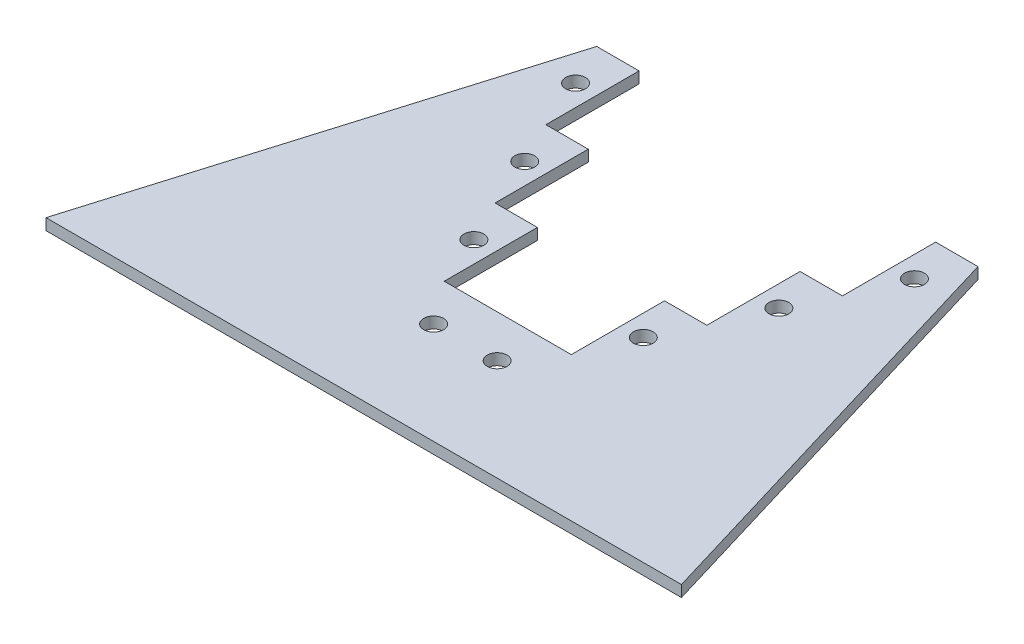
ISO-10303-21;
HEADER;
FILE_DESCRIPTION(('STEP AP214'),'2;1');
FILE_NAME('part.step','',(''),(''),'','','');
FILE_SCHEMA(('AUTOMOTIVE_DESIGN { 1 0 10303 214 1 1 1 1 }'));
ENDSEC;
DATA;
#1=APPLICATION_CONTEXT('core data for automotive mechanical design processes');
#2=APPLICATION_PROTOCOL_DEFINITION('international standard','automotive_design',2000,#1);
#3=PRODUCT_CONTEXT('',#1,'mechanical');
#4=PRODUCT('Part','Part','',(#3));
#5=PRODUCT_RELATED_PRODUCT_CATEGORY('part','',(#4));
#6=PRODUCT_DEFINITION_FORMATION('','',#4);
#7=PRODUCT_DEFINITION_CONTEXT('part definition',#1,'design');
#8=PRODUCT_DEFINITION('design','',#6,#7);
#9=PRODUCT_DEFINITION_SHAPE('','',#8);
#10=(LENGTH_UNIT() NAMED_UNIT(*) SI_UNIT(.MILLI.,.METRE.));
#11=(NAMED_UNIT(*) PLANE_ANGLE_UNIT() SI_UNIT($,.RADIAN.));
#12=(NAMED_UNIT(*) SI_UNIT($,.STERADIAN.) SOLID_ANGLE_UNIT());
#13=UNCERTAINTY_MEASURE_WITH_UNIT(LENGTH_MEASURE(1.E-05),#10,'distance_accuracy_value','');
#14=(GEOMETRIC_REPRESENTATION_CONTEXT(3) GLOBAL_UNCERTAINTY_ASSIGNED_CONTEXT((#13)) GLOBAL_UNIT_ASSIGNED_CONTEXT((#10,
#11,#12)) REPRESENTATION_CONTEXT('',''));
#15=CARTESIAN_POINT('',(0.,0.,0.));
#16=DIRECTION('',(0.,0.,1.));
#17=DIRECTION('',(1.,0.,0.));
#18=AXIS2_PLACEMENT_3D('',#15,#16,#17);
#19=CARTESIAN_POINT('',(0.,4.,0.));
#20=DIRECTION('',(0.,0.,-1.));
#21=DIRECTION('',(-1.,0.,0.));
#22=AXIS2_PLACEMENT_3D('',#19,#20,#21);
#23=PLANE('',#22);
#24=DIRECTION('',(1.,0.,0.));
#25=VECTOR('',#24,1.);
#26=CARTESIAN_POINT('',(0.,0.,0.));
#27=LINE('',#26,#25);
#28=CARTESIAN_POINT('',(-180.,0.,0.));
#29=VERTEX_POINT('',#28);
#30=CARTESIAN_POINT('',(45.0000000000001,0.,0.));
#31=VERTEX_POINT('',#30);
#32=EDGE_CURVE('E195',#29,#31,#27,.T.);
#33=ORIENTED_EDGE('',*,*,#32,.T.);
#34=DIRECTION('',(0.,-1.,0.));
#35=VECTOR('',#34,1.);
#36=CARTESIAN_POINT('',(45.0000000000001,4.,0.));
#37=LINE('',#36,#35);
#38=CARTESIAN_POINT('',(45.0000000000001,4.,0.));
#39=VERTEX_POINT('',#38);
#40=EDGE_CURVE('E11',#39,#31,#37,.T.);
#41=ORIENTED_EDGE('',*,*,#40,.F.);
#42=DIRECTION('',(1.,0.,0.));
#43=VECTOR('',#42,1.);
#44=CARTESIAN_POINT('',(0.,4.,0.));
#45=LINE('',#44,#43);
#46=CARTESIAN_POINT('',(-180.,4.,0.));
#47=VERTEX_POINT('',#46);
#48=EDGE_CURVE('E238',#47,#39,#45,.T.);
#49=ORIENTED_EDGE('',*,*,#48,.F.);
#50=DIRECTION('',(0.,-1.,0.));
#51=VECTOR('',#50,1.);
#52=CARTESIAN_POINT('',(-180.,4.,0.));
#53=LINE('',#52,#51);
#54=EDGE_CURVE('E63',#47,#29,#53,.T.);
#55=ORIENTED_EDGE('',*,*,#54,.T.);
#56=EDGE_LOOP('',(#33,#41,#49,#55));
#57=FACE_BOUND('',#56,.T.);
#58=ADVANCED_FACE('F47',(#57),#23,.F.);
#59=CARTESIAN_POINT('',(41.2844036697248,4.,-12.3853211009175));
#60=DIRECTION('',(-0.957826285221151,0.,0.287347885566346));
#61=DIRECTION('',(0.287347885566346,0.,0.957826285221151));
#62=AXIS2_PLACEMENT_3D('',#59,#60,#61);
#63=PLANE('',#62);
#64=DIRECTION('',(-0.287347885566346,0.,-0.957826285221151));
#65=VECTOR('',#64,1.);
#66=CARTESIAN_POINT('',(41.2844036697248,0.,-12.3853211009175));
#67=LINE('',#66,#65);
#68=CARTESIAN_POINT('',(0.,0.,-150.));
#69=VERTEX_POINT('',#68);
#70=EDGE_CURVE('E197',#31,#69,#67,.T.);
#71=ORIENTED_EDGE('',*,*,#70,.T.);
#72=DIRECTION('',(0.,-1.,0.));
#73=VECTOR('',#72,1.);
#74=CARTESIAN_POINT('',(0.,4.,-150.));
#75=LINE('',#74,#73);
#76=CARTESIAN_POINT('',(0.,4.,-150.));
#77=VERTEX_POINT('',#76);
#78=EDGE_CURVE('E55',#77,#69,#75,.T.);
#79=ORIENTED_EDGE('',*,*,#78,.F.);
#80=DIRECTION('',(-0.287347885566346,0.,-0.957826285221151));
#81=VECTOR('',#80,1.);
#82=CARTESIAN_POINT('',(41.2844036697248,4.,-12.3853211009175));
#83=LINE('',#82,#81);
#84=EDGE_CURVE('E126',#39,#77,#83,.T.);
#85=ORIENTED_EDGE('',*,*,#84,.F.);
#86=ORIENTED_EDGE('',*,*,#40,.T.);
#87=EDGE_LOOP('',(#71,#79,#85,#86));
#88=FACE_BOUND('',#87,.T.);
#89=ADVANCED_FACE('F322',(#88),#63,.F.);
#90=CARTESIAN_POINT('',(0.,4.,-150.));
#91=DIRECTION('',(0.,0.,1.));
#92=DIRECTION('',(1.,0.,0.));
#93=AXIS2_PLACEMENT_3D('',#90,#91,#92);
#94=PLANE('',#93);
#95=DIRECTION('',(-1.,0.,0.));
#96=VECTOR('',#95,1.);
#97=CARTESIAN_POINT('',(0.,0.,-150.));
#98=LINE('',#97,#96);
#99=CARTESIAN_POINT('',(-15.,0.,-150.));
#100=VERTEX_POINT('',#99);
#101=EDGE_CURVE('E200',#69,#100,#98,.T.);
#102=ORIENTED_EDGE('',*,*,#101,.T.);
#103=DIRECTION('',(0.,-1.,0.));
#104=VECTOR('',#103,1.);
#105=CARTESIAN_POINT('',(-15.,4.,-150.));
#106=LINE('',#105,#104);
#107=CARTESIAN_POINT('',(-15.,4.,-150.));
#108=VERTEX_POINT('',#107);
#109=EDGE_CURVE('E260',#108,#100,#106,.T.);
#110=ORIENTED_EDGE('',*,*,#109,.F.);
#111=DIRECTION('',(-1.,0.,0.));
#112=VECTOR('',#111,1.);
#113=CARTESIAN_POINT('',(0.,4.,-150.));
#114=LINE('',#113,#112);
#115=EDGE_CURVE('E183',#77,#108,#114,.T.);
#116=ORIENTED_EDGE('',*,*,#115,.F.);
#117=ORIENTED_EDGE('',*,*,#78,.T.);
#118=EDGE_LOOP('',(#102,#110,#116,#117));
#119=FACE_BOUND('',#118,.T.);
#120=ADVANCED_FACE('F265',(#119),#94,.F.);
#121=CARTESIAN_POINT('',(-15.,4.,0.));
#122=DIRECTION('',(-1.,0.,0.));
#123=DIRECTION('',(0.,0.,1.));
#124=AXIS2_PLACEMENT_3D('',#121,#122,#123);
#125=PLANE('',#124);
#126=DIRECTION('',(0.,0.,-1.));
#127=VECTOR('',#126,1.);
#128=CARTESIAN_POINT('',(-15.,0.,0.));
#129=LINE('',#128,#127);
#130=CARTESIAN_POINT('',(-15.,0.,-117.));
#131=VERTEX_POINT('',#130);
#132=EDGE_CURVE('E203',#131,#100,#129,.T.);
#133=ORIENTED_EDGE('',*,*,#132,.F.);
#134=DIRECTION('',(0.,-1.,0.));
#135=VECTOR('',#134,1.);
#136=CARTESIAN_POINT('',(-15.,4.,-117.));
#137=LINE('',#136,#135);
#138=CARTESIAN_POINT('',(-15.,4.,-117.));
#139=VERTEX_POINT('',#138);
#140=EDGE_CURVE('E258',#139,#131,#137,.T.);
#141=ORIENTED_EDGE('',*,*,#140,.F.);
#142=DIRECTION('',(0.,0.,-1.));
#143=VECTOR('',#142,1.);
#144=CARTESIAN_POINT('',(-15.,4.,0.));
#145=LINE('',#144,#143);
#146=EDGE_CURVE('E275',#139,#108,#145,.T.);
#147=ORIENTED_EDGE('',*,*,#146,.T.);
#148=ORIENTED_EDGE('',*,*,#109,.T.);
#149=EDGE_LOOP('',(#133,#141,#147,#148));
#150=FACE_BOUND('',#149,.T.);
#151=ADVANCED_FACE('F272',(#150),#125,.T.);
#152=CARTESIAN_POINT('',(0.,4.,-117.));
#153=DIRECTION('',(0.,0.,-1.));
#154=DIRECTION('',(-1.,0.,0.));
#155=AXIS2_PLACEMENT_3D('',#152,#153,#154);
#156=PLANE('',#155);
#157=DIRECTION('',(1.,0.,0.));
#158=VECTOR('',#157,1.);
#159=CARTESIAN_POINT('',(0.,0.,-117.));
#160=LINE('',#159,#158);
#161=CARTESIAN_POINT('',(-30.,0.,-117.));
#162=VERTEX_POINT('',#161);
#163=EDGE_CURVE('E207',#162,#131,#160,.T.);
#164=ORIENTED_EDGE('',*,*,#163,.F.);
#165=DIRECTION('',(0.,-1.,0.));
#166=VECTOR('',#165,1.);
#167=CARTESIAN_POINT('',(-30.,4.,-117.));
#168=LINE('',#167,#166);
#169=CARTESIAN_POINT('',(-30.,4.,-117.));
#170=VERTEX_POINT('',#169);
#171=EDGE_CURVE('E256',#170,#162,#168,.T.);
#172=ORIENTED_EDGE('',*,*,#171,.F.);
#173=DIRECTION('',(1.,0.,0.));
#174=VECTOR('',#173,1.);
#175=CARTESIAN_POINT('',(0.,4.,-117.));
#176=LINE('',#175,#174);
#177=EDGE_CURVE('E278',#170,#139,#176,.T.);
#178=ORIENTED_EDGE('',*,*,#177,.T.);
#179=ORIENTED_EDGE('',*,*,#140,.T.);
#180=EDGE_LOOP('',(#164,#172,#178,#179));
#181=FACE_BOUND('',#180,.T.);
#182=ADVANCED_FACE('F582',(#181),#156,.T.);
#183=CARTESIAN_POINT('',(-30.,4.,0.));
#184=DIRECTION('',(-1.,0.,0.));
#185=DIRECTION('',(0.,0.,1.));
#186=AXIS2_PLACEMENT_3D('',#183,#184,#185);
#187=PLANE('',#186);
#188=DIRECTION('',(0.,0.,-1.));
#189=VECTOR('',#188,1.);
#190=CARTESIAN_POINT('',(-30.,0.,0.));
#191=LINE('',#190,#189);
#192=CARTESIAN_POINT('',(-30.,0.,-83.9999999999999));
#193=VERTEX_POINT('',#192);
#194=EDGE_CURVE('E210',#193,#162,#191,.T.);
#195=ORIENTED_EDGE('',*,*,#194,.F.);
#196=DIRECTION('',(0.,-1.,0.));
#197=VECTOR('',#196,1.);
#198=CARTESIAN_POINT('',(-30.,4.,-83.9999999999999));
#199=LINE('',#198,#197);
#200=CARTESIAN_POINT('',(-30.,4.,-83.9999999999999));
#201=VERTEX_POINT('',#200);
#202=EDGE_CURVE('E254',#201,#193,#199,.T.);
#203=ORIENTED_EDGE('',*,*,#202,.F.);
#204=DIRECTION('',(0.,0.,-1.));
#205=VECTOR('',#204,1.);
#206=CARTESIAN_POINT('',(-30.,4.,0.));
#207=LINE('',#206,#205);
#208=EDGE_CURVE('E280',#201,#170,#207,.T.);
#209=ORIENTED_EDGE('',*,*,#208,.T.);
#210=ORIENTED_EDGE('',*,*,#171,.T.);
#211=EDGE_LOOP('',(#195,#203,#209,#210));
#212=FACE_BOUND('',#211,.T.);
#213=ADVANCED_FACE('F573',(#212),#187,.T.);
#214=CARTESIAN_POINT('',(0.,4.,-83.9999999999999));
#215=DIRECTION('',(0.,0.,-1.));
#216=DIRECTION('',(-1.,0.,0.));
#217=AXIS2_PLACEMENT_3D('',#214,#215,#216);
#218=PLANE('',#217);
#219=DIRECTION('',(1.,0.,0.));
#220=VECTOR('',#219,1.);
#221=CARTESIAN_POINT('',(0.,0.,-83.9999999999999));
#222=LINE('',#221,#220);
#223=CARTESIAN_POINT('',(-45.,0.,-83.9999999999999));
#224=VERTEX_POINT('',#223);
#225=EDGE_CURVE('E213',#224,#193,#222,.T.);
#226=ORIENTED_EDGE('',*,*,#225,.F.);
#227=DIRECTION('',(0.,-1.,0.));
#228=VECTOR('',#227,1.);
#229=CARTESIAN_POINT('',(-45.,4.,-83.9999999999999));
#230=LINE('',#229,#228);
#231=CARTESIAN_POINT('',(-45.,4.,-83.9999999999999));
#232=VERTEX_POINT('',#231);
#233=EDGE_CURVE('E252',#232,#224,#230,.T.);
#234=ORIENTED_EDGE('',*,*,#233,.F.);
#235=DIRECTION('',(1.,0.,0.));
#236=VECTOR('',#235,1.);
#237=CARTESIAN_POINT('',(0.,4.,-83.9999999999999));
#238=LINE('',#237,#236);
#239=EDGE_CURVE('E286',#232,#201,#238,.T.);
#240=ORIENTED_EDGE('',*,*,#239,.T.);
#241=ORIENTED_EDGE('',*,*,#202,.T.);
#242=EDGE_LOOP('',(#226,#234,#240,#241));
#243=FACE_BOUND('',#242,.T.);
#244=ADVANCED_FACE('F564',(#243),#218,.T.);
#245=CARTESIAN_POINT('',(-45.,4.,0.));
#246=DIRECTION('',(-1.,0.,0.));
#247=DIRECTION('',(0.,0.,1.));
#248=AXIS2_PLACEMENT_3D('',#245,#246,#247);
#249=PLANE('',#248);
#250=DIRECTION('',(0.,0.,-1.));
#251=VECTOR('',#250,1.);
#252=CARTESIAN_POINT('',(-45.,0.,0.));
#253=LINE('',#252,#251);
#254=CARTESIAN_POINT('',(-45.,0.,-51.));
#255=VERTEX_POINT('',#254);
#256=EDGE_CURVE('E216',#255,#224,#253,.T.);
#257=ORIENTED_EDGE('',*,*,#256,.F.);
#258=DIRECTION('',(0.,-1.,0.));
#259=VECTOR('',#258,1.);
#260=CARTESIAN_POINT('',(-45.,4.,-51.));
#261=LINE('',#260,#259);
#262=CARTESIAN_POINT('',(-45.,4.,-51.));
#263=VERTEX_POINT('',#262);
#264=EDGE_CURVE('E250',#263,#255,#261,.T.);
#265=ORIENTED_EDGE('',*,*,#264,.F.);
#266=DIRECTION('',(0.,0.,-1.));
#267=VECTOR('',#266,1.);
#268=CARTESIAN_POINT('',(-45.,4.,0.));
#269=LINE('',#268,#267);
#270=EDGE_CURVE('E289',#263,#232,#269,.T.);
#271=ORIENTED_EDGE('',*,*,#270,.T.);
#272=ORIENTED_EDGE('',*,*,#233,.T.);
#273=EDGE_LOOP('',(#257,#265,#271,#272));
#274=FACE_BOUND('',#273,.T.);
#275=ADVANCED_FACE('F555',(#274),#249,.T.);
#276=CARTESIAN_POINT('',(0.,4.,-51.));
#277=DIRECTION('',(0.,0.,-1.));
#278=DIRECTION('',(-1.,0.,0.));
#279=AXIS2_PLACEMENT_3D('',#276,#277,#278);
#280=PLANE('',#279);
#281=DIRECTION('',(1.,0.,0.));
#282=VECTOR('',#281,1.);
#283=CARTESIAN_POINT('',(0.,0.,-51.));
#284=LINE('',#283,#282);
#285=CARTESIAN_POINT('',(-89.9999999999999,0.,-51.));
#286=VERTEX_POINT('',#285);
#287=EDGE_CURVE('E219',#286,#255,#284,.T.);
#288=ORIENTED_EDGE('',*,*,#287,.F.);
#289=DIRECTION('',(0.,-1.,0.));
#290=VECTOR('',#289,1.);
#291=CARTESIAN_POINT('',(-89.9999999999999,4.,-51.));
#292=LINE('',#291,#290);
#293=CARTESIAN_POINT('',(-89.9999999999999,4.,-51.));
#294=VERTEX_POINT('',#293);
#295=EDGE_CURVE('E248',#294,#286,#292,.T.);
#296=ORIENTED_EDGE('',*,*,#295,.F.);
#297=DIRECTION('',(1.,0.,0.));
#298=VECTOR('',#297,1.);
#299=CARTESIAN_POINT('',(0.,4.,-51.));
#300=LINE('',#299,#298);
#301=EDGE_CURVE('E292',#294,#263,#300,.T.);
#302=ORIENTED_EDGE('',*,*,#301,.T.);
#303=ORIENTED_EDGE('',*,*,#264,.T.);
#304=EDGE_LOOP('',(#288,#296,#302,#303));
#305=FACE_BOUND('',#304,.T.);
#306=ADVANCED_FACE('F546',(#305),#280,.T.);
#307=CARTESIAN_POINT('',(-89.9999999999999,4.,0.));
#308=DIRECTION('',(1.,0.,0.));
#309=DIRECTION('',(0.,0.,-1.));
#310=AXIS2_PLACEMENT_3D('',#307,#308,#309);
#311=PLANE('',#310);
#312=DIRECTION('',(0.,0.,1.));
#313=VECTOR('',#312,1.);
#314=CARTESIAN_POINT('',(-89.9999999999999,0.,0.));
#315=LINE('',#314,#313);
#316=CARTESIAN_POINT('',(-89.9999999999999,0.,-83.9999999999999));
#317=VERTEX_POINT('',#316);
#318=EDGE_CURVE('E222',#317,#286,#315,.T.);
#319=ORIENTED_EDGE('',*,*,#318,.F.);
#320=DIRECTION('',(0.,-1.,0.));
#321=VECTOR('',#320,1.);
#322=CARTESIAN_POINT('',(-89.9999999999999,4.,-83.9999999999999));
#323=LINE('',#322,#321);
#324=CARTESIAN_POINT('',(-89.9999999999999,4.,-83.9999999999999));
#325=VERTEX_POINT('',#324);
#326=EDGE_CURVE('E246',#325,#317,#323,.T.);
#327=ORIENTED_EDGE('',*,*,#326,.F.);
#328=DIRECTION('',(0.,0.,1.));
#329=VECTOR('',#328,1.);
#330=CARTESIAN_POINT('',(-89.9999999999999,4.,0.));
#331=LINE('',#330,#329);
#332=EDGE_CURVE('E295',#325,#294,#331,.T.);
#333=ORIENTED_EDGE('',*,*,#332,.T.);
#334=ORIENTED_EDGE('',*,*,#295,.T.);
#335=EDGE_LOOP('',(#319,#327,#333,#334));
#336=FACE_BOUND('',#335,.T.);
#337=ADVANCED_FACE('F537',(#336),#311,.T.);
#338=CARTESIAN_POINT('',(0.,4.,-83.9999999999999));
#339=DIRECTION('',(0.,0.,-1.));
#340=DIRECTION('',(-1.,0.,0.));
#341=AXIS2_PLACEMENT_3D('',#338,#339,#340);
#342=PLANE('',#341);
#343=DIRECTION('',(1.,0.,0.));
#344=VECTOR('',#343,1.);
#345=CARTESIAN_POINT('',(0.,0.,-83.9999999999999));
#346=LINE('',#345,#344);
#347=CARTESIAN_POINT('',(-105.,0.,-84.));
#348=VERTEX_POINT('',#347);
#349=EDGE_CURVE('E225',#348,#317,#346,.T.);
#350=ORIENTED_EDGE('',*,*,#349,.F.);
#351=DIRECTION('',(0.,-1.,0.));
#352=VECTOR('',#351,1.);
#353=CARTESIAN_POINT('',(-105.,4.,-84.));
#354=LINE('',#353,#352);
#355=CARTESIAN_POINT('',(-105.,4.,-84.));
#356=VERTEX_POINT('',#355);
#357=EDGE_CURVE('E244',#356,#348,#354,.T.);
#358=ORIENTED_EDGE('',*,*,#357,.F.);
#359=DIRECTION('',(1.,0.,0.));
#360=VECTOR('',#359,1.);
#361=CARTESIAN_POINT('',(0.,4.,-83.9999999999999));
#362=LINE('',#361,#360);
#363=EDGE_CURVE('E298',#356,#325,#362,.T.);
#364=ORIENTED_EDGE('',*,*,#363,.T.);
#365=ORIENTED_EDGE('',*,*,#326,.T.);
#366=EDGE_LOOP('',(#350,#358,#364,#365));
#367=FACE_BOUND('',#366,.T.);
#368=ADVANCED_FACE('F529',(#367),#342,.T.);
#369=CARTESIAN_POINT('',(-105.,4.,0.));
#370=DIRECTION('',(1.,0.,0.));
#371=DIRECTION('',(0.,0.,-1.));
#372=AXIS2_PLACEMENT_3D('',#369,#370,#371);
#373=PLANE('',#372);
#374=DIRECTION('',(0.,0.,1.));
#375=VECTOR('',#374,1.);
#376=CARTESIAN_POINT('',(-105.,0.,0.));
#377=LINE('',#376,#375);
#378=CARTESIAN_POINT('',(-105.,0.,-117.));
#379=VERTEX_POINT('',#378);
#380=EDGE_CURVE('E228',#379,#348,#377,.T.);
#381=ORIENTED_EDGE('',*,*,#380,.F.);
#382=DIRECTION('',(0.,-1.,0.));
#383=VECTOR('',#382,1.);
#384=CARTESIAN_POINT('',(-105.,4.,-117.));
#385=LINE('',#384,#383);
#386=CARTESIAN_POINT('',(-105.,4.,-117.));
#387=VERTEX_POINT('',#386);
#388=EDGE_CURVE('E242',#387,#379,#385,.T.);
#389=ORIENTED_EDGE('',*,*,#388,.F.);
#390=DIRECTION('',(0.,0.,1.));
#391=VECTOR('',#390,1.);
#392=CARTESIAN_POINT('',(-105.,4.,0.));
#393=LINE('',#392,#391);
#394=EDGE_CURVE('E190',#387,#356,#393,.T.);
#395=ORIENTED_EDGE('',*,*,#394,.T.);
#396=ORIENTED_EDGE('',*,*,#357,.T.);
#397=EDGE_LOOP('',(#381,#389,#395,#396));
#398=FACE_BOUND('',#397,.T.);
#399=ADVANCED_FACE('F303',(#398),#373,.T.);
#400=CARTESIAN_POINT('',(0.,4.,-117.));
#401=DIRECTION('',(0.,0.,-1.));
#402=DIRECTION('',(-1.,0.,0.));
#403=AXIS2_PLACEMENT_3D('',#400,#401,#402);
#404=PLANE('',#403);
#405=DIRECTION('',(1.,0.,0.));
#406=VECTOR('',#405,1.);
#407=CARTESIAN_POINT('',(0.,0.,-117.));
#408=LINE('',#407,#406);
#409=CARTESIAN_POINT('',(-120.,0.,-117.));
#410=VERTEX_POINT('',#409);
#411=EDGE_CURVE('E231',#410,#379,#408,.T.);
#412=ORIENTED_EDGE('',*,*,#411,.F.);
#413=DIRECTION('',(0.,-1.,0.));
#414=VECTOR('',#413,1.);
#415=CARTESIAN_POINT('',(-120.,4.,-117.));
#416=LINE('',#415,#414);
#417=CARTESIAN_POINT('',(-120.,4.,-117.));
#418=VERTEX_POINT('',#417);
#419=EDGE_CURVE('E175',#418,#410,#416,.T.);
#420=ORIENTED_EDGE('',*,*,#419,.F.);
#421=DIRECTION('',(1.,0.,0.));
#422=VECTOR('',#421,1.);
#423=CARTESIAN_POINT('',(0.,4.,-117.));
#424=LINE('',#423,#422);
#425=EDGE_CURVE('E188',#418,#387,#424,.T.);
#426=ORIENTED_EDGE('',*,*,#425,.T.);
#427=ORIENTED_EDGE('',*,*,#388,.T.);
#428=EDGE_LOOP('',(#412,#420,#426,#427));
#429=FACE_BOUND('',#428,.T.);
#430=ADVANCED_FACE('F309',(#429),#404,.T.);
#431=CARTESIAN_POINT('',(-120.,4.,0.));
#432=DIRECTION('',(1.,0.,0.));
#433=DIRECTION('',(0.,0.,-1.));
#434=AXIS2_PLACEMENT_3D('',#431,#432,#433);
#435=PLANE('',#434);
#436=DIRECTION('',(0.,0.,1.));
#437=VECTOR('',#436,1.);
#438=CARTESIAN_POINT('',(-120.,0.,0.));
#439=LINE('',#438,#437);
#440=CARTESIAN_POINT('',(-120.,0.,-150.));
#441=VERTEX_POINT('',#440);
#442=EDGE_CURVE('E172',#441,#410,#439,.T.);
#443=ORIENTED_EDGE('',*,*,#442,.F.);
#444=DIRECTION('',(0.,-1.,0.));
#445=VECTOR('',#444,1.);
#446=CARTESIAN_POINT('',(-120.,4.,-150.));
#447=LINE('',#446,#445);
#448=CARTESIAN_POINT('',(-120.,4.,-150.));
#449=VERTEX_POINT('',#448);
#450=EDGE_CURVE('E166',#449,#441,#447,.T.);
#451=ORIENTED_EDGE('',*,*,#450,.F.);
#452=DIRECTION('',(0.,0.,1.));
#453=VECTOR('',#452,1.);
#454=CARTESIAN_POINT('',(-120.,4.,0.));
#455=LINE('',#454,#453);
#456=EDGE_CURVE('E170',#449,#418,#455,.T.);
#457=ORIENTED_EDGE('',*,*,#456,.T.);
#458=ORIENTED_EDGE('',*,*,#419,.T.);
#459=EDGE_LOOP('',(#443,#451,#457,#458));
#460=FACE_BOUND('',#459,.T.);
#461=ADVANCED_FACE('F168',(#460),#435,.T.);
#462=CARTESIAN_POINT('',(-135.,0.,-150.));
#463=VERTEX_POINT('',#462);
#464=EDGE_CURVE('E204',#441,#463,#98,.T.);
#465=ORIENTED_EDGE('',*,*,#464,.T.);
#466=DIRECTION('',(0.,-1.,0.));
#467=VECTOR('',#466,1.);
#468=CARTESIAN_POINT('',(-135.,4.,-150.));
#469=LINE('',#468,#467);
#470=CARTESIAN_POINT('',(-135.,4.,-150.));
#471=VERTEX_POINT('',#470);
#472=EDGE_CURVE('E114',#471,#463,#469,.T.);
#473=ORIENTED_EDGE('',*,*,#472,.F.);
#474=EDGE_CURVE('E177',#449,#471,#114,.T.);
#475=ORIENTED_EDGE('',*,*,#474,.F.);
#476=ORIENTED_EDGE('',*,*,#450,.T.);
#477=EDGE_LOOP('',(#465,#473,#475,#476));
#478=FACE_BOUND('',#477,.T.);
#479=ADVANCED_FACE('F178',(#478),#94,.F.);
#480=CARTESIAN_POINT('',(-165.137614678899,4.,-49.5412844036697));
#481=DIRECTION('',(-0.957826285221151,0.,-0.287347885566346));
#482=DIRECTION('',(-0.287347885566346,0.,0.957826285221151));
#483=AXIS2_PLACEMENT_3D('',#480,#481,#482);
#484=PLANE('',#483);
#485=DIRECTION('',(0.287347885566346,0.,-0.957826285221151));
#486=VECTOR('',#485,1.);
#487=CARTESIAN_POINT('',(-165.137614678899,0.,-49.5412844036697));
#488=LINE('',#487,#486);
#489=EDGE_CURVE('E235',#29,#463,#488,.T.);
#490=ORIENTED_EDGE('',*,*,#489,.F.);
#491=ORIENTED_EDGE('',*,*,#54,.F.);
#492=DIRECTION('',(0.287347885566346,0.,-0.957826285221151));
#493=VECTOR('',#492,1.);
#494=CARTESIAN_POINT('',(-165.137614678899,4.,-49.5412844036697));
#495=LINE('',#494,#493);
#496=EDGE_CURVE('E181',#47,#471,#495,.T.);
#497=ORIENTED_EDGE('',*,*,#496,.T.);
#498=ORIENTED_EDGE('',*,*,#472,.T.);
#499=EDGE_LOOP('',(#490,#491,#497,#498));
#500=FACE_BOUND('',#499,.T.);
#501=ADVANCED_FACE('F310',(#500),#484,.T.);
#502=CARTESIAN_POINT('',(0.,4.,0.));
#503=DIRECTION('',(0.,1.,0.));
#504=DIRECTION('',(0.,0.,1.));
#505=AXIS2_PLACEMENT_3D('',#502,#503,#504);
#506=PLANE('',#505);
#507=CARTESIAN_POINT('',(-127.5,4.,-135.));
#508=DIRECTION('',(0.,1.,0.));
#509=DIRECTION('',(0.,0.,1.));
#510=AXIS2_PLACEMENT_3D('',#507,#508,#509);
#511=CIRCLE('',#510,3.50000000000001);
#512=CARTESIAN_POINT('',(-127.5,4.,-131.5));
#513=VERTEX_POINT('',#512);
#514=EDGE_CURVE('E371',#513,#513,#511,.T.);
#515=ORIENTED_EDGE('',*,*,#514,.F.);
#516=EDGE_LOOP('',(#515));
#517=FACE_BOUND('',#516,.T.);
#518=CARTESIAN_POINT('',(-112.5,4.,-102.));
#519=DIRECTION('',(0.,1.,0.));
#520=DIRECTION('',(0.,0.,1.));
#521=AXIS2_PLACEMENT_3D('',#518,#519,#520);
#522=CIRCLE('',#521,3.50000000000001);
#523=CARTESIAN_POINT('',(-112.5,4.,-98.5));
#524=VERTEX_POINT('',#523);
#525=EDGE_CURVE('E368',#524,#524,#522,.T.);
#526=ORIENTED_EDGE('',*,*,#525,.F.);
#527=EDGE_LOOP('',(#526));
#528=FACE_BOUND('',#527,.T.);
#529=CARTESIAN_POINT('',(-97.4999999999999,4.,-69.));
#530=DIRECTION('',(0.,1.,0.));
#531=DIRECTION('',(0.,0.,1.));
#532=AXIS2_PLACEMENT_3D('',#529,#530,#531);
#533=CIRCLE('',#532,3.50000000000001);
#534=CARTESIAN_POINT('',(-97.4999999999999,4.,-65.5));
#535=VERTEX_POINT('',#534);
#536=EDGE_CURVE('E362',#535,#535,#533,.T.);
#537=ORIENTED_EDGE('',*,*,#536,.F.);
#538=EDGE_LOOP('',(#537));
#539=FACE_BOUND('',#538,.T.);
#540=CARTESIAN_POINT('',(-78.7499999999999,4.,-36.));
#541=DIRECTION('',(0.,1.,0.));
#542=DIRECTION('',(0.,0.,1.));
#543=AXIS2_PLACEMENT_3D('',#540,#541,#542);
#544=CIRCLE('',#543,3.50000000000001);
#545=CARTESIAN_POINT('',(-78.7499999999999,4.,-32.4999999999999));
#546=VERTEX_POINT('',#545);
#547=EDGE_CURVE('E356',#546,#546,#544,.T.);
#548=ORIENTED_EDGE('',*,*,#547,.F.);
#549=EDGE_LOOP('',(#548));
#550=FACE_BOUND('',#549,.T.);
#551=CARTESIAN_POINT('',(-56.25,4.,-36.));
#552=DIRECTION('',(0.,1.,0.));
#553=DIRECTION('',(0.,0.,-1.));
#554=AXIS2_PLACEMENT_3D('',#551,#552,#553);
#555=CIRCLE('',#554,3.50000000000001);
#556=CARTESIAN_POINT('',(-56.25,4.,-39.5));
#557=VERTEX_POINT('',#556);
#558=EDGE_CURVE('E350',#557,#557,#555,.T.);
#559=ORIENTED_EDGE('',*,*,#558,.F.);
#560=EDGE_LOOP('',(#559));
#561=FACE_BOUND('',#560,.T.);
#562=CARTESIAN_POINT('',(-37.5,4.,-69.));
#563=DIRECTION('',(0.,1.,0.));
#564=DIRECTION('',(0.,0.,-1.));
#565=AXIS2_PLACEMENT_3D('',#562,#563,#564);
#566=CIRCLE('',#565,3.5);
#567=CARTESIAN_POINT('',(-37.5,4.,-72.5));
#568=VERTEX_POINT('',#567);
#569=EDGE_CURVE('E344',#568,#568,#566,.T.);
#570=ORIENTED_EDGE('',*,*,#569,.F.);
#571=EDGE_LOOP('',(#570));
#572=FACE_BOUND('',#571,.T.);
#573=CARTESIAN_POINT('',(-22.5,4.,-102.));
#574=DIRECTION('',(0.,1.,0.));
#575=DIRECTION('',(0.,0.,-1.));
#576=AXIS2_PLACEMENT_3D('',#573,#574,#575);
#577=CIRCLE('',#576,3.5);
#578=CARTESIAN_POINT('',(-22.5,4.,-105.5));
#579=VERTEX_POINT('',#578);
#580=EDGE_CURVE('E338',#579,#579,#577,.T.);
#581=ORIENTED_EDGE('',*,*,#580,.F.);
#582=EDGE_LOOP('',(#581));
#583=FACE_BOUND('',#582,.T.);
#584=CARTESIAN_POINT('',(-7.5000000000001,4.,-135.));
#585=DIRECTION('',(0.,1.,0.));
#586=DIRECTION('',(0.,0.,-1.));
#587=AXIS2_PLACEMENT_3D('',#584,#585,#586);
#588=CIRCLE('',#587,3.50000000000001);
#589=CARTESIAN_POINT('',(-7.5000000000001,4.,-138.5));
#590=VERTEX_POINT('',#589);
#591=EDGE_CURVE('E332',#590,#590,#588,.T.);
#592=ORIENTED_EDGE('',*,*,#591,.F.);
#593=EDGE_LOOP('',(#592));
#594=FACE_BOUND('',#593,.T.);
#595=ORIENTED_EDGE('',*,*,#48,.T.);
#596=ORIENTED_EDGE('',*,*,#84,.T.);
#597=ORIENTED_EDGE('',*,*,#115,.T.);
#598=ORIENTED_EDGE('',*,*,#146,.F.);
#599=ORIENTED_EDGE('',*,*,#177,.F.);
#600=ORIENTED_EDGE('',*,*,#208,.F.);
#601=ORIENTED_EDGE('',*,*,#239,.F.);
#602=ORIENTED_EDGE('',*,*,#270,.F.);
#603=ORIENTED_EDGE('',*,*,#301,.F.);
#604=ORIENTED_EDGE('',*,*,#332,.F.);
#605=ORIENTED_EDGE('',*,*,#363,.F.);
#606=ORIENTED_EDGE('',*,*,#394,.F.);
#607=ORIENTED_EDGE('',*,*,#425,.F.);
#608=ORIENTED_EDGE('',*,*,#456,.F.);
#609=ORIENTED_EDGE('',*,*,#474,.T.);
#610=ORIENTED_EDGE('',*,*,#496,.F.);
#611=EDGE_LOOP('',(#595,#596,#597,#598,#599,#600,#601,#602,#603,#604,#605,#606,#607,#608,#609,#610));
#612=FACE_BOUND('',#611,.T.);
#613=ADVANCED_FACE('F185',(#517,#528,#539,#550,#561,#572,#583,#594,#612),#506,.T.);
#614=CARTESIAN_POINT('',(0.,0.,0.));
#615=DIRECTION('',(0.,1.,0.));
#616=DIRECTION('',(0.,0.,1.));
#617=AXIS2_PLACEMENT_3D('',#614,#615,#616);
#618=PLANE('',#617);
#619=CARTESIAN_POINT('',(-127.5,0.,-135.));
#620=DIRECTION('',(0.,1.,0.));
#621=DIRECTION('',(0.,0.,1.));
#622=AXIS2_PLACEMENT_3D('',#619,#620,#621);
#623=CIRCLE('',#622,3.50000000000001);
#624=CARTESIAN_POINT('',(-127.5,0.,-131.5));
#625=VERTEX_POINT('',#624);
#626=EDGE_CURVE('E198',#625,#625,#623,.T.);
#627=ORIENTED_EDGE('',*,*,#626,.T.);
#628=EDGE_LOOP('',(#627));
#629=FACE_BOUND('',#628,.T.);
#630=CARTESIAN_POINT('',(-112.5,0.,-102.));
#631=DIRECTION('',(0.,1.,0.));
#632=DIRECTION('',(0.,0.,1.));
#633=AXIS2_PLACEMENT_3D('',#630,#631,#632);
#634=CIRCLE('',#633,3.50000000000001);
#635=CARTESIAN_POINT('',(-112.5,0.,-98.5));
#636=VERTEX_POINT('',#635);
#637=EDGE_CURVE('E365',#636,#636,#634,.T.);
#638=ORIENTED_EDGE('',*,*,#637,.T.);
#639=EDGE_LOOP('',(#638));
#640=FACE_BOUND('',#639,.T.);
#641=CARTESIAN_POINT('',(-97.4999999999999,0.,-69.));
#642=DIRECTION('',(0.,1.,0.));
#643=DIRECTION('',(0.,0.,1.));
#644=AXIS2_PLACEMENT_3D('',#641,#642,#643);
#645=CIRCLE('',#644,3.50000000000001);
#646=CARTESIAN_POINT('',(-97.4999999999999,0.,-65.5));
#647=VERTEX_POINT('',#646);
#648=EDGE_CURVE('E359',#647,#647,#645,.T.);
#649=ORIENTED_EDGE('',*,*,#648,.T.);
#650=EDGE_LOOP('',(#649));
#651=FACE_BOUND('',#650,.T.);
#652=CARTESIAN_POINT('',(-78.7499999999999,0.,-36.));
#653=DIRECTION('',(0.,1.,0.));
#654=DIRECTION('',(0.,0.,1.));
#655=AXIS2_PLACEMENT_3D('',#652,#653,#654);
#656=CIRCLE('',#655,3.50000000000001);
#657=CARTESIAN_POINT('',(-78.7499999999999,0.,-32.4999999999999));
#658=VERTEX_POINT('',#657);
#659=EDGE_CURVE('E353',#658,#658,#656,.T.);
#660=ORIENTED_EDGE('',*,*,#659,.T.);
#661=EDGE_LOOP('',(#660));
#662=FACE_BOUND('',#661,.T.);
#663=CARTESIAN_POINT('',(-56.25,0.,-36.));
#664=DIRECTION('',(0.,1.,0.));
#665=DIRECTION('',(0.,0.,-1.));
#666=AXIS2_PLACEMENT_3D('',#663,#664,#665);
#667=CIRCLE('',#666,3.50000000000001);
#668=CARTESIAN_POINT('',(-56.25,0.,-39.5));
#669=VERTEX_POINT('',#668);
#670=EDGE_CURVE('E347',#669,#669,#667,.T.);
#671=ORIENTED_EDGE('',*,*,#670,.T.);
#672=EDGE_LOOP('',(#671));
#673=FACE_BOUND('',#672,.T.);
#674=CARTESIAN_POINT('',(-37.5,0.,-69.));
#675=DIRECTION('',(0.,1.,0.));
#676=DIRECTION('',(0.,0.,-1.));
#677=AXIS2_PLACEMENT_3D('',#674,#675,#676);
#678=CIRCLE('',#677,3.5);
#679=CARTESIAN_POINT('',(-37.5,0.,-72.5));
#680=VERTEX_POINT('',#679);
#681=EDGE_CURVE('E341',#680,#680,#678,.T.);
#682=ORIENTED_EDGE('',*,*,#681,.T.);
#683=EDGE_LOOP('',(#682));
#684=FACE_BOUND('',#683,.T.);
#685=CARTESIAN_POINT('',(-22.5,0.,-102.));
#686=DIRECTION('',(0.,1.,0.));
#687=DIRECTION('',(0.,0.,-1.));
#688=AXIS2_PLACEMENT_3D('',#685,#686,#687);
#689=CIRCLE('',#688,3.5);
#690=CARTESIAN_POINT('',(-22.5,0.,-105.5));
#691=VERTEX_POINT('',#690);
#692=EDGE_CURVE('E335',#691,#691,#689,.T.);
#693=ORIENTED_EDGE('',*,*,#692,.T.);
#694=EDGE_LOOP('',(#693));
#695=FACE_BOUND('',#694,.T.);
#696=CARTESIAN_POINT('',(-7.5000000000001,0.,-135.));
#697=DIRECTION('',(0.,1.,0.));
#698=DIRECTION('',(0.,0.,-1.));
#699=AXIS2_PLACEMENT_3D('',#696,#697,#698);
#700=CIRCLE('',#699,3.50000000000001);
#701=CARTESIAN_POINT('',(-7.5000000000001,0.,-138.5));
#702=VERTEX_POINT('',#701);
#703=EDGE_CURVE('E329',#702,#702,#700,.T.);
#704=ORIENTED_EDGE('',*,*,#703,.T.);
#705=EDGE_LOOP('',(#704));
#706=FACE_BOUND('',#705,.T.);
#707=ORIENTED_EDGE('',*,*,#32,.F.);
#708=ORIENTED_EDGE('',*,*,#489,.T.);
#709=ORIENTED_EDGE('',*,*,#464,.F.);
#710=ORIENTED_EDGE('',*,*,#442,.T.);
#711=ORIENTED_EDGE('',*,*,#411,.T.);
#712=ORIENTED_EDGE('',*,*,#380,.T.);
#713=ORIENTED_EDGE('',*,*,#349,.T.);
#714=ORIENTED_EDGE('',*,*,#318,.T.);
#715=ORIENTED_EDGE('',*,*,#287,.T.);
#716=ORIENTED_EDGE('',*,*,#256,.T.);
#717=ORIENTED_EDGE('',*,*,#225,.T.);
#718=ORIENTED_EDGE('',*,*,#194,.T.);
#719=ORIENTED_EDGE('',*,*,#163,.T.);
#720=ORIENTED_EDGE('',*,*,#132,.T.);
#721=ORIENTED_EDGE('',*,*,#101,.F.);
#722=ORIENTED_EDGE('',*,*,#70,.F.);
#723=EDGE_LOOP('',(#707,#708,#709,#710,#711,#712,#713,#714,#715,#716,#717,#718,#719,#720,#721,#722));
#724=FACE_BOUND('',#723,.T.);
#725=ADVANCED_FACE('F268',(#629,#640,#651,#662,#673,#684,#695,#706,#724),#618,.F.);
#726=CARTESIAN_POINT('',(-7.5000000000001,0.,-135.));
#727=DIRECTION('',(0.,1.,0.));
#728=DIRECTION('',(0.,0.,1.));
#729=AXIS2_PLACEMENT_3D('',#726,#727,#728);
#730=CYLINDRICAL_SURFACE('',#729,3.50000000000001);
#731=ORIENTED_EDGE('',*,*,#703,.F.);
#732=EDGE_LOOP('',(#731));
#733=FACE_BOUND('',#732,.T.);
#734=ORIENTED_EDGE('',*,*,#591,.T.);
#735=EDGE_LOOP('',(#734));
#736=FACE_BOUND('',#735,.T.);
#737=ADVANCED_FACE('F400',(#733,#736),#730,.F.);
#738=CARTESIAN_POINT('',(-22.5,0.,-102.));
#739=DIRECTION('',(0.,1.,0.));
#740=DIRECTION('',(0.,0.,1.));
#741=AXIS2_PLACEMENT_3D('',#738,#739,#740);
#742=CYLINDRICAL_SURFACE('',#741,3.5);
#743=ORIENTED_EDGE('',*,*,#692,.F.);
#744=EDGE_LOOP('',(#743));
#745=FACE_BOUND('',#744,.T.);
#746=ORIENTED_EDGE('',*,*,#580,.T.);
#747=EDGE_LOOP('',(#746));
#748=FACE_BOUND('',#747,.T.);
#749=ADVANCED_FACE('F402',(#745,#748),#742,.F.);
#750=CARTESIAN_POINT('',(-37.5,0.,-69.));
#751=DIRECTION('',(0.,1.,0.));
#752=DIRECTION('',(0.,0.,1.));
#753=AXIS2_PLACEMENT_3D('',#750,#751,#752);
#754=CYLINDRICAL_SURFACE('',#753,3.5);
#755=ORIENTED_EDGE('',*,*,#681,.F.);
#756=EDGE_LOOP('',(#755));
#757=FACE_BOUND('',#756,.T.);
#758=ORIENTED_EDGE('',*,*,#569,.T.);
#759=EDGE_LOOP('',(#758));
#760=FACE_BOUND('',#759,.T.);
#761=ADVANCED_FACE('F409',(#757,#760),#754,.F.);
#762=CARTESIAN_POINT('',(-56.25,0.,-36.));
#763=DIRECTION('',(0.,1.,0.));
#764=DIRECTION('',(0.,0.,1.));
#765=AXIS2_PLACEMENT_3D('',#762,#763,#764);
#766=CYLINDRICAL_SURFACE('',#765,3.50000000000001);
#767=ORIENTED_EDGE('',*,*,#670,.F.);
#768=EDGE_LOOP('',(#767));
#769=FACE_BOUND('',#768,.T.);
#770=ORIENTED_EDGE('',*,*,#558,.T.);
#771=EDGE_LOOP('',(#770));
#772=FACE_BOUND('',#771,.T.);
#773=ADVANCED_FACE('F416',(#769,#772),#766,.F.);
#774=CARTESIAN_POINT('',(-78.7499999999999,0.,-36.));
#775=DIRECTION('',(0.,1.,0.));
#776=DIRECTION('',(0.,0.,1.));
#777=AXIS2_PLACEMENT_3D('',#774,#775,#776);
#778=CYLINDRICAL_SURFACE('',#777,3.50000000000001);
#779=ORIENTED_EDGE('',*,*,#659,.F.);
#780=EDGE_LOOP('',(#779));
#781=FACE_BOUND('',#780,.T.);
#782=ORIENTED_EDGE('',*,*,#547,.T.);
#783=EDGE_LOOP('',(#782));
#784=FACE_BOUND('',#783,.T.);
#785=ADVANCED_FACE('F420',(#781,#784),#778,.F.);
#786=CARTESIAN_POINT('',(-97.4999999999999,0.,-69.));
#787=DIRECTION('',(0.,1.,0.));
#788=DIRECTION('',(0.,0.,1.));
#789=AXIS2_PLACEMENT_3D('',#786,#787,#788);
#790=CYLINDRICAL_SURFACE('',#789,3.50000000000001);
#791=ORIENTED_EDGE('',*,*,#648,.F.);
#792=EDGE_LOOP('',(#791));
#793=FACE_BOUND('',#792,.T.);
#794=ORIENTED_EDGE('',*,*,#536,.T.);
#795=EDGE_LOOP('',(#794));
#796=FACE_BOUND('',#795,.T.);
#797=ADVANCED_FACE('F424',(#793,#796),#790,.F.);
#798=CARTESIAN_POINT('',(-112.5,0.,-102.));
#799=DIRECTION('',(0.,1.,0.));
#800=DIRECTION('',(0.,0.,1.));
#801=AXIS2_PLACEMENT_3D('',#798,#799,#800);
#802=CYLINDRICAL_SURFACE('',#801,3.50000000000001);
#803=ORIENTED_EDGE('',*,*,#637,.F.);
#804=EDGE_LOOP('',(#803));
#805=FACE_BOUND('',#804,.T.);
#806=ORIENTED_EDGE('',*,*,#525,.T.);
#807=EDGE_LOOP('',(#806));
#808=FACE_BOUND('',#807,.T.);
#809=ADVANCED_FACE('F382',(#805,#808),#802,.F.);
#810=CARTESIAN_POINT('',(-127.5,0.,-135.));
#811=DIRECTION('',(0.,1.,0.));
#812=DIRECTION('',(0.,0.,1.));
#813=AXIS2_PLACEMENT_3D('',#810,#811,#812);
#814=CYLINDRICAL_SURFACE('',#813,3.50000000000001);
#815=ORIENTED_EDGE('',*,*,#626,.F.);
#816=EDGE_LOOP('',(#815));
#817=FACE_BOUND('',#816,.T.);
#818=ORIENTED_EDGE('',*,*,#514,.T.);
#819=EDGE_LOOP('',(#818));
#820=FACE_BOUND('',#819,.T.);
#821=ADVANCED_FACE('F379',(#817,#820),#814,.F.);
#822=CLOSED_SHELL('',(#58,#89,#120,#151,#182,#213,#244,#275,#306,#337,#368,#399,#430,#461,#479,
#501,#613,#725,#737,#749,#761,#773,#785,#797,#809,#821));
#823=MANIFOLD_SOLID_BREP('B2',#822);
#824=ADVANCED_BREP_SHAPE_REPRESENTATION('',(#18,#823),#14);
#825=SHAPE_DEFINITION_REPRESENTATION(#9,#824);
ENDSEC;
END-ISO-10303-21;
